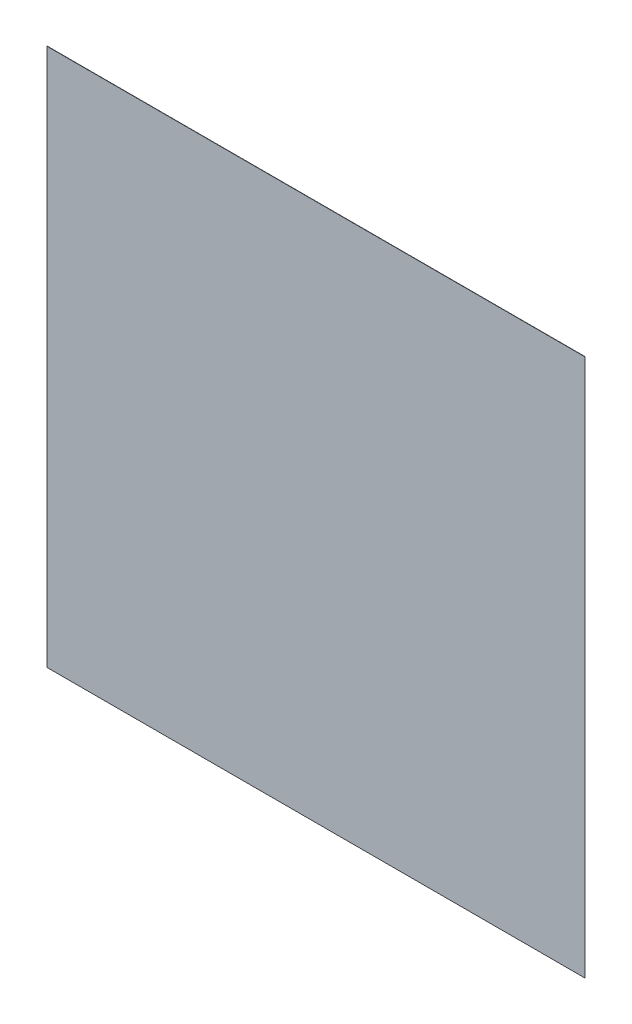
ISO-10303-21;
HEADER;
FILE_DESCRIPTION(('STEP AP214'),'2;1');
FILE_NAME('part.step','',(''),(''),'','','');
FILE_SCHEMA(('AUTOMOTIVE_DESIGN { 1 0 10303 214 1 1 1 1 }'));
ENDSEC;
DATA;
#1=APPLICATION_CONTEXT('core data for automotive mechanical design processes');
#2=APPLICATION_PROTOCOL_DEFINITION('international standard','automotive_design',2000,#1);
#3=PRODUCT_CONTEXT('',#1,'mechanical');
#4=PRODUCT('Part','Part','',(#3));
#5=PRODUCT_RELATED_PRODUCT_CATEGORY('part','',(#4));
#6=PRODUCT_DEFINITION_FORMATION('','',#4);
#7=PRODUCT_DEFINITION_CONTEXT('part definition',#1,'design');
#8=PRODUCT_DEFINITION('design','',#6,#7);
#9=PRODUCT_DEFINITION_SHAPE('','',#8);
#10=(LENGTH_UNIT() NAMED_UNIT(*) SI_UNIT(.MILLI.,.METRE.));
#11=(NAMED_UNIT(*) PLANE_ANGLE_UNIT() SI_UNIT($,.RADIAN.));
#12=(NAMED_UNIT(*) SI_UNIT($,.STERADIAN.) SOLID_ANGLE_UNIT());
#13=UNCERTAINTY_MEASURE_WITH_UNIT(LENGTH_MEASURE(1.E-05),#10,'distance_accuracy_value','');
#14=(GEOMETRIC_REPRESENTATION_CONTEXT(3) GLOBAL_UNCERTAINTY_ASSIGNED_CONTEXT((#13)) GLOBAL_UNIT_ASSIGNED_CONTEXT((#10,
#11,#12)) REPRESENTATION_CONTEXT('',''));
#15=CARTESIAN_POINT('',(0.,0.,0.));
#16=DIRECTION('',(0.,0.,1.));
#17=DIRECTION('',(1.,0.,0.));
#18=AXIS2_PLACEMENT_3D('',#15,#16,#17);
#19=CARTESIAN_POINT('',(15.,-15.,0.015));
#20=DIRECTION('',(-1.,0.,0.));
#21=DIRECTION('',(0.,0.,1.));
#22=AXIS2_PLACEMENT_3D('',#19,#20,#21);
#23=PLANE('',#22);
#24=DIRECTION('',(0.,1.,0.));
#25=VECTOR('',#24,1.);
#26=CARTESIAN_POINT('',(15.,-15.,0.));
#27=LINE('',#26,#25);
#28=CARTESIAN_POINT('',(15.,-15.,0.));
#29=VERTEX_POINT('',#28);
#30=CARTESIAN_POINT('',(15.,15.,0.));
#31=VERTEX_POINT('',#30);
#32=EDGE_CURVE('E96',#29,#31,#27,.T.);
#33=ORIENTED_EDGE('',*,*,#32,.T.);
#34=DIRECTION('',(0.,0.,-1.));
#35=VECTOR('',#34,1.);
#36=CARTESIAN_POINT('',(15.,15.,0.015));
#37=LINE('',#36,#35);
#38=CARTESIAN_POINT('',(15.,15.,0.015));
#39=VERTEX_POINT('',#38);
#40=EDGE_CURVE('E11',#39,#31,#37,.T.);
#41=ORIENTED_EDGE('',*,*,#40,.F.);
#42=DIRECTION('',(0.,1.,0.));
#43=VECTOR('',#42,1.);
#44=CARTESIAN_POINT('',(15.,-15.,0.015));
#45=LINE('',#44,#43);
#46=CARTESIAN_POINT('',(15.,-15.,0.015));
#47=VERTEX_POINT('',#46);
#48=EDGE_CURVE('E84',#47,#39,#45,.T.);
#49=ORIENTED_EDGE('',*,*,#48,.F.);
#50=DIRECTION('',(0.,0.,-1.));
#51=VECTOR('',#50,1.);
#52=CARTESIAN_POINT('',(15.,-15.,0.015));
#53=LINE('',#52,#51);
#54=EDGE_CURVE('E92',#47,#29,#53,.T.);
#55=ORIENTED_EDGE('',*,*,#54,.T.);
#56=EDGE_LOOP('',(#33,#41,#49,#55));
#57=FACE_BOUND('',#56,.T.);
#58=ADVANCED_FACE('F33',(#57),#23,.F.);
#59=CARTESIAN_POINT('',(-15.,15.,0.015));
#60=DIRECTION('',(0.,-1.,0.));
#61=DIRECTION('',(0.,0.,-1.));
#62=AXIS2_PLACEMENT_3D('',#59,#60,#61);
#63=PLANE('',#62);
#64=DIRECTION('',(-1.,0.,0.));
#65=VECTOR('',#64,1.);
#66=CARTESIAN_POINT('',(-15.,15.,0.));
#67=LINE('',#66,#65);
#68=CARTESIAN_POINT('',(-15.,15.,0.));
#69=VERTEX_POINT('',#68);
#70=EDGE_CURVE('E88',#31,#69,#67,.T.);
#71=ORIENTED_EDGE('',*,*,#70,.T.);
#72=DIRECTION('',(0.,0.,-1.));
#73=VECTOR('',#72,1.);
#74=CARTESIAN_POINT('',(-15.,15.,0.015));
#75=LINE('',#74,#73);
#76=CARTESIAN_POINT('',(-15.,15.,0.015));
#77=VERTEX_POINT('',#76);
#78=EDGE_CURVE('E41',#77,#69,#75,.T.);
#79=ORIENTED_EDGE('',*,*,#78,.F.);
#80=DIRECTION('',(-1.,0.,0.));
#81=VECTOR('',#80,1.);
#82=CARTESIAN_POINT('',(-15.,15.,0.015));
#83=LINE('',#82,#81);
#84=EDGE_CURVE('E79',#39,#77,#83,.T.);
#85=ORIENTED_EDGE('',*,*,#84,.F.);
#86=ORIENTED_EDGE('',*,*,#40,.T.);
#87=EDGE_LOOP('',(#71,#79,#85,#86));
#88=FACE_BOUND('',#87,.T.);
#89=ADVANCED_FACE('F87',(#88),#63,.F.);
#90=CARTESIAN_POINT('',(-15.,-15.,0.015));
#91=DIRECTION('',(1.,0.,0.));
#92=DIRECTION('',(0.,0.,-1.));
#93=AXIS2_PLACEMENT_3D('',#90,#91,#92);
#94=PLANE('',#93);
#95=DIRECTION('',(0.,-1.,0.));
#96=VECTOR('',#95,1.);
#97=CARTESIAN_POINT('',(-15.,-15.,0.));
#98=LINE('',#97,#96);
#99=CARTESIAN_POINT('',(-15.,-15.,0.));
#100=VERTEX_POINT('',#99);
#101=EDGE_CURVE('E66',#69,#100,#98,.T.);
#102=ORIENTED_EDGE('',*,*,#101,.T.);
#103=DIRECTION('',(0.,0.,-1.));
#104=VECTOR('',#103,1.);
#105=CARTESIAN_POINT('',(-15.,-15.,0.015));
#106=LINE('',#105,#104);
#107=CARTESIAN_POINT('',(-15.,-15.,0.015));
#108=VERTEX_POINT('',#107);
#109=EDGE_CURVE('E89',#108,#100,#106,.T.);
#110=ORIENTED_EDGE('',*,*,#109,.F.);
#111=DIRECTION('',(0.,-1.,0.));
#112=VECTOR('',#111,1.);
#113=CARTESIAN_POINT('',(-15.,-15.,0.015));
#114=LINE('',#113,#112);
#115=EDGE_CURVE('E82',#77,#108,#114,.T.);
#116=ORIENTED_EDGE('',*,*,#115,.F.);
#117=ORIENTED_EDGE('',*,*,#78,.T.);
#118=EDGE_LOOP('',(#102,#110,#116,#117));
#119=FACE_BOUND('',#118,.T.);
#120=ADVANCED_FACE('F90',(#119),#94,.F.);
#121=CARTESIAN_POINT('',(-15.,-15.,0.015));
#122=DIRECTION('',(0.,1.,0.));
#123=DIRECTION('',(0.,0.,1.));
#124=AXIS2_PLACEMENT_3D('',#121,#122,#123);
#125=PLANE('',#124);
#126=DIRECTION('',(1.,0.,0.));
#127=VECTOR('',#126,1.);
#128=CARTESIAN_POINT('',(-15.,-15.,0.));
#129=LINE('',#128,#127);
#130=EDGE_CURVE('E72',#100,#29,#129,.T.);
#131=ORIENTED_EDGE('',*,*,#130,.T.);
#132=ORIENTED_EDGE('',*,*,#54,.F.);
#133=DIRECTION('',(1.,0.,0.));
#134=VECTOR('',#133,1.);
#135=CARTESIAN_POINT('',(-15.,-15.,0.015));
#136=LINE('',#135,#134);
#137=EDGE_CURVE('E49',#108,#47,#136,.T.);
#138=ORIENTED_EDGE('',*,*,#137,.F.);
#139=ORIENTED_EDGE('',*,*,#109,.T.);
#140=EDGE_LOOP('',(#131,#132,#138,#139));
#141=FACE_BOUND('',#140,.T.);
#142=ADVANCED_FACE('F103',(#141),#125,.F.);
#143=CARTESIAN_POINT('',(0.,0.,0.015));
#144=DIRECTION('',(0.,0.,-1.));
#145=DIRECTION('',(-1.,0.,0.));
#146=AXIS2_PLACEMENT_3D('',#143,#144,#145);
#147=PLANE('',#146);
#148=ORIENTED_EDGE('',*,*,#48,.T.);
#149=ORIENTED_EDGE('',*,*,#84,.T.);
#150=ORIENTED_EDGE('',*,*,#115,.T.);
#151=ORIENTED_EDGE('',*,*,#137,.T.);
#152=EDGE_LOOP('',(#148,#149,#150,#151));
#153=FACE_BOUND('',#152,.T.);
#154=ADVANCED_FACE('F80',(#153),#147,.F.);
#155=CARTESIAN_POINT('',(0.,0.,0.));
#156=DIRECTION('',(0.,0.,-1.));
#157=DIRECTION('',(-1.,0.,0.));
#158=AXIS2_PLACEMENT_3D('',#155,#156,#157);
#159=PLANE('',#158);
#160=ORIENTED_EDGE('',*,*,#32,.F.);
#161=ORIENTED_EDGE('',*,*,#130,.F.);
#162=ORIENTED_EDGE('',*,*,#101,.F.);
#163=ORIENTED_EDGE('',*,*,#70,.F.);
#164=EDGE_LOOP('',(#160,#161,#162,#163));
#165=FACE_BOUND('',#164,.T.);
#166=ADVANCED_FACE('F106',(#165),#159,.T.);
#167=CLOSED_SHELL('',(#58,#89,#120,#142,#154,#166));
#168=MANIFOLD_SOLID_BREP('B2',#167);
#169=ADVANCED_BREP_SHAPE_REPRESENTATION('',(#18,#168),#14);
#170=SHAPE_DEFINITION_REPRESENTATION(#9,#169);
ENDSEC;
END-ISO-10303-21;
